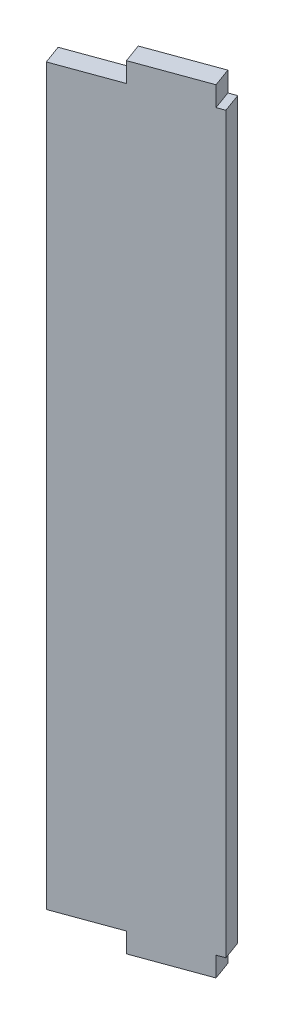
ISO-10303-21;
HEADER;
FILE_DESCRIPTION(('STEP AP214'),'2;1');
FILE_NAME('part.step','',(''),(''),'','','');
FILE_SCHEMA(('AUTOMOTIVE_DESIGN { 1 0 10303 214 1 1 1 1 }'));
ENDSEC;
DATA;
#1=APPLICATION_CONTEXT('core data for automotive mechanical design processes');
#2=APPLICATION_PROTOCOL_DEFINITION('international standard','automotive_design',2000,#1);
#3=PRODUCT_CONTEXT('',#1,'mechanical');
#4=PRODUCT('Part','Part','',(#3));
#5=PRODUCT_RELATED_PRODUCT_CATEGORY('part','',(#4));
#6=PRODUCT_DEFINITION_FORMATION('','',#4);
#7=PRODUCT_DEFINITION_CONTEXT('part definition',#1,'design');
#8=PRODUCT_DEFINITION('design','',#6,#7);
#9=PRODUCT_DEFINITION_SHAPE('','',#8);
#10=(LENGTH_UNIT() NAMED_UNIT(*) SI_UNIT(.MILLI.,.METRE.));
#11=(NAMED_UNIT(*) PLANE_ANGLE_UNIT() SI_UNIT($,.RADIAN.));
#12=(NAMED_UNIT(*) SI_UNIT($,.STERADIAN.) SOLID_ANGLE_UNIT());
#13=UNCERTAINTY_MEASURE_WITH_UNIT(LENGTH_MEASURE(1.E-05),#10,'distance_accuracy_value','');
#14=(GEOMETRIC_REPRESENTATION_CONTEXT(3) GLOBAL_UNCERTAINTY_ASSIGNED_CONTEXT((#13)) GLOBAL_UNIT_ASSIGNED_CONTEXT((#10,
#11,#12)) REPRESENTATION_CONTEXT('',''));
#15=CARTESIAN_POINT('',(0.,0.,0.));
#16=DIRECTION('',(0.,0.,1.));
#17=DIRECTION('',(1.,0.,0.));
#18=AXIS2_PLACEMENT_3D('',#15,#16,#17);
#19=CARTESIAN_POINT('',(81.6522586267483,18.4931544247679,109.399122485471));
#20=DIRECTION('',(0.939692620785908,0.,-0.34202014332567));
#21=DIRECTION('',(-0.34202014332567,0.,-0.939692620785908));
#22=AXIS2_PLACEMENT_3D('',#19,#20,#21);
#23=PLANE('',#22);
#24=DIRECTION('',(0.,-1.,0.));
#25=VECTOR('',#24,1.);
#26=CARTESIAN_POINT('',(80.6843416211367,18.4931544247679,106.739792368647));
#27=LINE('',#26,#25);
#28=CARTESIAN_POINT('',(80.6843416211367,18.4931544247679,106.739792368647));
#29=VERTEX_POINT('',#28);
#30=CARTESIAN_POINT('',(80.6843416211367,15.6631544247679,106.739792368647));
#31=VERTEX_POINT('',#30);
#32=EDGE_CURVE('E153',#29,#31,#27,.T.);
#33=ORIENTED_EDGE('',*,*,#32,.T.);
#34=DIRECTION('',(-0.34202014332567,0.,-0.939692620785908));
#35=VECTOR('',#34,1.);
#36=CARTESIAN_POINT('',(81.6522586267483,15.6631544247679,109.399122485471));
#37=LINE('',#36,#35);
#38=CARTESIAN_POINT('',(81.6522586267483,15.6631544247679,109.399122485471));
#39=VERTEX_POINT('',#38);
#40=EDGE_CURVE('E11',#39,#31,#37,.T.);
#41=ORIENTED_EDGE('',*,*,#40,.F.);
#42=DIRECTION('',(0.,-1.,0.));
#43=VECTOR('',#42,1.);
#44=CARTESIAN_POINT('',(81.6522586267483,18.4931544247679,109.399122485471));
#45=LINE('',#44,#43);
#46=CARTESIAN_POINT('',(81.6522586267483,18.4931544247679,109.399122485471));
#47=VERTEX_POINT('',#46);
#48=EDGE_CURVE('E175',#47,#39,#45,.T.);
#49=ORIENTED_EDGE('',*,*,#48,.F.);
#50=DIRECTION('',(-0.34202014332567,0.,-0.939692620785908));
#51=VECTOR('',#50,1.);
#52=CARTESIAN_POINT('',(81.6522586267483,18.4931544247679,109.399122485471));
#53=LINE('',#52,#51);
#54=EDGE_CURVE('E149',#47,#29,#53,.T.);
#55=ORIENTED_EDGE('',*,*,#54,.T.);
#56=EDGE_LOOP('',(#33,#41,#49,#55));
#57=FACE_BOUND('',#56,.T.);
#58=ADVANCED_FACE('F33',(#57),#23,.F.);
#59=CARTESIAN_POINT('',(81.6522586267483,15.6631544247679,109.399122485471));
#60=DIRECTION('',(0.,1.,0.));
#61=DIRECTION('',(-1.,0.,0.));
#62=AXIS2_PLACEMENT_3D('',#59,#60,#61);
#63=PLANE('',#62);
#64=DIRECTION('',(0.939692620785908,0.,-0.34202014332567));
#65=VECTOR('',#64,1.);
#66=CARTESIAN_POINT('',(80.6843416211367,15.6631544247679,106.739792368647));
#67=LINE('',#66,#65);
#68=CARTESIAN_POINT('',(90.0812678289958,15.6631544247679,103.31959093539));
#69=VERTEX_POINT('',#68);
#70=EDGE_CURVE('E156',#31,#69,#67,.T.);
#71=ORIENTED_EDGE('',*,*,#70,.T.);
#72=DIRECTION('',(-0.34202014332567,0.,-0.939692620785908));
#73=VECTOR('',#72,1.);
#74=CARTESIAN_POINT('',(91.0491848346074,15.6631544247679,105.978921052214));
#75=LINE('',#74,#73);
#76=CARTESIAN_POINT('',(91.0491848346074,15.6631544247679,105.978921052214));
#77=VERTEX_POINT('',#76);
#78=EDGE_CURVE('E41',#77,#69,#75,.T.);
#79=ORIENTED_EDGE('',*,*,#78,.F.);
#80=DIRECTION('',(0.939692620785908,0.,-0.34202014332567));
#81=VECTOR('',#80,1.);
#82=CARTESIAN_POINT('',(81.6522586267483,15.6631544247679,109.399122485471));
#83=LINE('',#82,#81);
#84=EDGE_CURVE('E104',#39,#77,#83,.T.);
#85=ORIENTED_EDGE('',*,*,#84,.F.);
#86=ORIENTED_EDGE('',*,*,#40,.T.);
#87=EDGE_LOOP('',(#71,#79,#85,#86));
#88=FACE_BOUND('',#87,.T.);
#89=ADVANCED_FACE('F253',(#88),#63,.F.);
#90=CARTESIAN_POINT('',(91.0491848346074,15.6631544247679,105.978921052214));
#91=DIRECTION('',(-0.939692620785908,0.,0.34202014332567));
#92=DIRECTION('',(0.34202014332567,0.,0.939692620785908));
#93=AXIS2_PLACEMENT_3D('',#90,#91,#92);
#94=PLANE('',#93);
#95=DIRECTION('',(0.,1.,0.));
#96=VECTOR('',#95,1.);
#97=CARTESIAN_POINT('',(90.0812678289958,15.6631544247679,103.31959093539));
#98=LINE('',#97,#96);
#99=CARTESIAN_POINT('',(90.0812678289957,18.4931544247679,103.31959093539));
#100=VERTEX_POINT('',#99);
#101=EDGE_CURVE('E158',#69,#100,#98,.T.);
#102=ORIENTED_EDGE('',*,*,#101,.T.);
#103=DIRECTION('',(-0.34202014332567,0.,-0.939692620785908));
#104=VECTOR('',#103,1.);
#105=CARTESIAN_POINT('',(91.0491848346074,18.4931544247679,105.978921052214));
#106=LINE('',#105,#104);
#107=CARTESIAN_POINT('',(91.0491848346074,18.4931544247679,105.978921052214));
#108=VERTEX_POINT('',#107);
#109=EDGE_CURVE('E194',#108,#100,#106,.T.);
#110=ORIENTED_EDGE('',*,*,#109,.F.);
#111=DIRECTION('',(0.,1.,0.));
#112=VECTOR('',#111,1.);
#113=CARTESIAN_POINT('',(91.0491848346074,15.6631544247679,105.978921052214));
#114=LINE('',#113,#112);
#115=EDGE_CURVE('E202',#77,#108,#114,.T.);
#116=ORIENTED_EDGE('',*,*,#115,.F.);
#117=ORIENTED_EDGE('',*,*,#78,.T.);
#118=EDGE_LOOP('',(#102,#110,#116,#117));
#119=FACE_BOUND('',#118,.T.);
#120=ADVANCED_FACE('F200',(#119),#94,.F.);
#121=CARTESIAN_POINT('',(92.0823208338306,18.4931544247679,105.602890300548));
#122=DIRECTION('',(0.,1.,0.));
#123=DIRECTION('',(-1.,0.,0.));
#124=AXIS2_PLACEMENT_3D('',#121,#122,#123);
#125=PLANE('',#124);
#126=DIRECTION('',(0.939692620785908,0.,-0.342020143325669));
#127=VECTOR('',#126,1.);
#128=CARTESIAN_POINT('',(91.1144038282189,18.4931544247679,102.943560183724));
#129=LINE('',#128,#127);
#130=CARTESIAN_POINT('',(91.1144038282189,18.4931544247679,102.943560183724));
#131=VERTEX_POINT('',#130);
#132=EDGE_CURVE('E160',#100,#131,#129,.T.);
#133=ORIENTED_EDGE('',*,*,#132,.T.);
#134=DIRECTION('',(-0.34202014332567,0.,-0.939692620785908));
#135=VECTOR('',#134,1.);
#136=CARTESIAN_POINT('',(92.0823208338306,18.4931544247679,105.602890300548));
#137=LINE('',#136,#135);
#138=CARTESIAN_POINT('',(92.0823208338306,18.4931544247679,105.602890300548));
#139=VERTEX_POINT('',#138);
#140=EDGE_CURVE('E191',#139,#131,#137,.T.);
#141=ORIENTED_EDGE('',*,*,#140,.F.);
#142=DIRECTION('',(0.939692620785908,0.,-0.342020143325669));
#143=VECTOR('',#142,1.);
#144=CARTESIAN_POINT('',(92.0823208338306,18.4931544247679,105.602890300548));
#145=LINE('',#144,#143);
#146=EDGE_CURVE('E220',#108,#139,#145,.T.);
#147=ORIENTED_EDGE('',*,*,#146,.F.);
#148=ORIENTED_EDGE('',*,*,#109,.T.);
#149=EDGE_LOOP('',(#133,#141,#147,#148));
#150=FACE_BOUND('',#149,.T.);
#151=ADVANCED_FACE('F211',(#150),#125,.F.);
#152=CARTESIAN_POINT('',(92.0823208338306,123.493154424767,105.602890300548));
#153=DIRECTION('',(-0.939692620785908,0.,0.34202014332567));
#154=DIRECTION('',(0.34202014332567,0.,0.939692620785908));
#155=AXIS2_PLACEMENT_3D('',#152,#153,#154);
#156=PLANE('',#155);
#157=DIRECTION('',(0.,1.,0.));
#158=VECTOR('',#157,1.);
#159=CARTESIAN_POINT('',(91.1144038282189,123.493154424767,102.943560183724));
#160=LINE('',#159,#158);
#161=CARTESIAN_POINT('',(91.1144038282189,123.493154424767,102.943560183724));
#162=VERTEX_POINT('',#161);
#163=EDGE_CURVE('E162',#131,#162,#160,.T.);
#164=ORIENTED_EDGE('',*,*,#163,.T.);
#165=DIRECTION('',(-0.34202014332567,0.,-0.939692620785908));
#166=VECTOR('',#165,1.);
#167=CARTESIAN_POINT('',(92.0823208338306,123.493154424767,105.602890300548));
#168=LINE('',#167,#166);
#169=CARTESIAN_POINT('',(92.0823208338306,123.493154424767,105.602890300548));
#170=VERTEX_POINT('',#169);
#171=EDGE_CURVE('E188',#170,#162,#168,.T.);
#172=ORIENTED_EDGE('',*,*,#171,.F.);
#173=DIRECTION('',(0.,1.,0.));
#174=VECTOR('',#173,1.);
#175=CARTESIAN_POINT('',(92.0823208338306,123.493154424767,105.602890300548));
#176=LINE('',#175,#174);
#177=EDGE_CURVE('E217',#139,#170,#176,.T.);
#178=ORIENTED_EDGE('',*,*,#177,.F.);
#179=ORIENTED_EDGE('',*,*,#140,.T.);
#180=EDGE_LOOP('',(#164,#172,#178,#179));
#181=FACE_BOUND('',#180,.T.);
#182=ADVANCED_FACE('F215',(#181),#156,.F.);
#183=CARTESIAN_POINT('',(91.0491848346074,123.493154424767,105.978921052214));
#184=DIRECTION('',(0.,-1.,0.));
#185=DIRECTION('',(1.,0.,0.));
#186=AXIS2_PLACEMENT_3D('',#183,#184,#185);
#187=PLANE('',#186);
#188=DIRECTION('',(-0.939692620785908,0.,0.342020143325669));
#189=VECTOR('',#188,1.);
#190=CARTESIAN_POINT('',(90.0812678289957,123.493154424767,103.31959093539));
#191=LINE('',#190,#189);
#192=CARTESIAN_POINT('',(90.0812678289957,123.493154424767,103.31959093539));
#193=VERTEX_POINT('',#192);
#194=EDGE_CURVE('E164',#162,#193,#191,.T.);
#195=ORIENTED_EDGE('',*,*,#194,.T.);
#196=DIRECTION('',(-0.34202014332567,0.,-0.939692620785908));
#197=VECTOR('',#196,1.);
#198=CARTESIAN_POINT('',(91.0491848346074,123.493154424767,105.978921052214));
#199=LINE('',#198,#197);
#200=CARTESIAN_POINT('',(91.0491848346074,123.493154424767,105.978921052214));
#201=VERTEX_POINT('',#200);
#202=EDGE_CURVE('E185',#201,#193,#199,.T.);
#203=ORIENTED_EDGE('',*,*,#202,.F.);
#204=DIRECTION('',(-0.939692620785908,0.,0.342020143325669));
#205=VECTOR('',#204,1.);
#206=CARTESIAN_POINT('',(91.0491848346074,123.493154424767,105.978921052214));
#207=LINE('',#206,#205);
#208=EDGE_CURVE('E219',#170,#201,#207,.T.);
#209=ORIENTED_EDGE('',*,*,#208,.F.);
#210=ORIENTED_EDGE('',*,*,#171,.T.);
#211=EDGE_LOOP('',(#195,#203,#209,#210));
#212=FACE_BOUND('',#211,.T.);
#213=ADVANCED_FACE('F266',(#212),#187,.F.);
#214=CARTESIAN_POINT('',(91.0491848346074,123.493154424767,105.978921052214));
#215=DIRECTION('',(-0.939692620785908,0.,0.34202014332567));
#216=DIRECTION('',(0.34202014332567,0.,0.939692620785908));
#217=AXIS2_PLACEMENT_3D('',#214,#215,#216);
#218=PLANE('',#217);
#219=DIRECTION('',(0.,1.,0.));
#220=VECTOR('',#219,1.);
#221=CARTESIAN_POINT('',(90.0812678289957,123.493154424767,103.31959093539));
#222=LINE('',#221,#220);
#223=CARTESIAN_POINT('',(90.0812678289957,126.323154424767,103.31959093539));
#224=VERTEX_POINT('',#223);
#225=EDGE_CURVE('E166',#193,#224,#222,.T.);
#226=ORIENTED_EDGE('',*,*,#225,.T.);
#227=DIRECTION('',(-0.34202014332567,0.,-0.939692620785908));
#228=VECTOR('',#227,1.);
#229=CARTESIAN_POINT('',(91.0491848346074,126.323154424767,105.978921052214));
#230=LINE('',#229,#228);
#231=CARTESIAN_POINT('',(91.0491848346074,126.323154424767,105.978921052214));
#232=VERTEX_POINT('',#231);
#233=EDGE_CURVE('E182',#232,#224,#230,.T.);
#234=ORIENTED_EDGE('',*,*,#233,.F.);
#235=DIRECTION('',(0.,1.,0.));
#236=VECTOR('',#235,1.);
#237=CARTESIAN_POINT('',(91.0491848346074,123.493154424767,105.978921052214));
#238=LINE('',#237,#236);
#239=EDGE_CURVE('E222',#201,#232,#238,.T.);
#240=ORIENTED_EDGE('',*,*,#239,.F.);
#241=ORIENTED_EDGE('',*,*,#202,.T.);
#242=EDGE_LOOP('',(#226,#234,#240,#241));
#243=FACE_BOUND('',#242,.T.);
#244=ADVANCED_FACE('F269',(#243),#218,.F.);
#245=CARTESIAN_POINT('',(91.0491848346074,126.323154424767,105.978921052214));
#246=DIRECTION('',(0.,-1.,0.));
#247=DIRECTION('',(0.,0.,-1.));
#248=AXIS2_PLACEMENT_3D('',#245,#246,#247);
#249=PLANE('',#248);
#250=DIRECTION('',(-0.939692620785908,0.,0.342020143325669));
#251=VECTOR('',#250,1.);
#252=CARTESIAN_POINT('',(90.0812678289957,126.323154424767,103.31959093539));
#253=LINE('',#252,#251);
#254=CARTESIAN_POINT('',(80.6843416211366,126.323154424767,106.739792368647));
#255=VERTEX_POINT('',#254);
#256=EDGE_CURVE('E168',#224,#255,#253,.T.);
#257=ORIENTED_EDGE('',*,*,#256,.T.);
#258=DIRECTION('',(-0.34202014332567,0.,-0.939692620785908));
#259=VECTOR('',#258,1.);
#260=CARTESIAN_POINT('',(81.6522586267483,126.323154424767,109.399122485471));
#261=LINE('',#260,#259);
#262=CARTESIAN_POINT('',(81.6522586267483,126.323154424767,109.399122485471));
#263=VERTEX_POINT('',#262);
#264=EDGE_CURVE('E179',#263,#255,#261,.T.);
#265=ORIENTED_EDGE('',*,*,#264,.F.);
#266=DIRECTION('',(-0.939692620785908,0.,0.342020143325669));
#267=VECTOR('',#266,1.);
#268=CARTESIAN_POINT('',(91.0491848346074,126.323154424767,105.978921052214));
#269=LINE('',#268,#267);
#270=EDGE_CURVE('E228',#232,#263,#269,.T.);
#271=ORIENTED_EDGE('',*,*,#270,.F.);
#272=ORIENTED_EDGE('',*,*,#233,.T.);
#273=EDGE_LOOP('',(#257,#265,#271,#272));
#274=FACE_BOUND('',#273,.T.);
#275=ADVANCED_FACE('F234',(#274),#249,.F.);
#276=CARTESIAN_POINT('',(81.6522586267483,126.323154424767,109.399122485471));
#277=DIRECTION('',(0.939692620785908,0.,-0.34202014332567));
#278=DIRECTION('',(-0.34202014332567,0.,-0.939692620785908));
#279=AXIS2_PLACEMENT_3D('',#276,#277,#278);
#280=PLANE('',#279);
#281=DIRECTION('',(0.,-1.,0.));
#282=VECTOR('',#281,1.);
#283=CARTESIAN_POINT('',(80.6843416211366,126.323154424767,106.739792368647));
#284=LINE('',#283,#282);
#285=CARTESIAN_POINT('',(80.6843416211366,123.493154424767,106.739792368647));
#286=VERTEX_POINT('',#285);
#287=EDGE_CURVE('E170',#255,#286,#284,.T.);
#288=ORIENTED_EDGE('',*,*,#287,.T.);
#289=DIRECTION('',(-0.34202014332567,0.,-0.939692620785908));
#290=VECTOR('',#289,1.);
#291=CARTESIAN_POINT('',(81.6522586267483,123.493154424767,109.399122485471));
#292=LINE('',#291,#290);
#293=CARTESIAN_POINT('',(81.6522586267483,123.493154424767,109.399122485471));
#294=VERTEX_POINT('',#293);
#295=EDGE_CURVE('E144',#294,#286,#292,.T.);
#296=ORIENTED_EDGE('',*,*,#295,.F.);
#297=DIRECTION('',(0.,-1.,0.));
#298=VECTOR('',#297,1.);
#299=CARTESIAN_POINT('',(81.6522586267483,126.323154424767,109.399122485471));
#300=LINE('',#299,#298);
#301=EDGE_CURVE('E135',#263,#294,#300,.T.);
#302=ORIENTED_EDGE('',*,*,#301,.F.);
#303=ORIENTED_EDGE('',*,*,#264,.T.);
#304=EDGE_LOOP('',(#288,#296,#302,#303));
#305=FACE_BOUND('',#304,.T.);
#306=ADVANCED_FACE('F238',(#305),#280,.F.);
#307=CARTESIAN_POINT('',(73.2489145621063,123.493154424767,112.457689593298));
#308=DIRECTION('',(0.,-1.,0.));
#309=DIRECTION('',(0.,0.,-1.));
#310=AXIS2_PLACEMENT_3D('',#307,#308,#309);
#311=PLANE('',#310);
#312=DIRECTION('',(-0.939692620785908,0.,0.34202014332567));
#313=VECTOR('',#312,1.);
#314=CARTESIAN_POINT('',(72.2809975564946,123.493154424767,109.798359476474));
#315=LINE('',#314,#313);
#316=CARTESIAN_POINT('',(72.2809975564946,123.493154424767,109.798359476474));
#317=VERTEX_POINT('',#316);
#318=EDGE_CURVE('E143',#286,#317,#315,.T.);
#319=ORIENTED_EDGE('',*,*,#318,.T.);
#320=DIRECTION('',(-0.34202014332567,0.,-0.939692620785908));
#321=VECTOR('',#320,1.);
#322=CARTESIAN_POINT('',(73.2489145621063,123.493154424767,112.457689593298));
#323=LINE('',#322,#321);
#324=CARTESIAN_POINT('',(73.2489145621063,123.493154424767,112.457689593298));
#325=VERTEX_POINT('',#324);
#326=EDGE_CURVE('E140',#325,#317,#323,.T.);
#327=ORIENTED_EDGE('',*,*,#326,.F.);
#328=DIRECTION('',(-0.939692620785908,0.,0.34202014332567));
#329=VECTOR('',#328,1.);
#330=CARTESIAN_POINT('',(73.2489145621063,123.493154424767,112.457689593298));
#331=LINE('',#330,#329);
#332=EDGE_CURVE('E129',#294,#325,#331,.T.);
#333=ORIENTED_EDGE('',*,*,#332,.F.);
#334=ORIENTED_EDGE('',*,*,#295,.T.);
#335=EDGE_LOOP('',(#319,#327,#333,#334));
#336=FACE_BOUND('',#335,.T.);
#337=ADVANCED_FACE('F141',(#336),#311,.F.);
#338=CARTESIAN_POINT('',(73.2489145621063,18.4931544247679,112.457689593298));
#339=DIRECTION('',(0.939692620785908,0.,-0.34202014332567));
#340=DIRECTION('',(-0.34202014332567,0.,-0.939692620785908));
#341=AXIS2_PLACEMENT_3D('',#338,#339,#340);
#342=PLANE('',#341);
#343=DIRECTION('',(0.,-1.,0.));
#344=VECTOR('',#343,1.);
#345=CARTESIAN_POINT('',(72.2809975564946,18.4931544247679,109.798359476474));
#346=LINE('',#345,#344);
#347=CARTESIAN_POINT('',(72.2809975564946,18.4931544247679,109.798359476474));
#348=VERTEX_POINT('',#347);
#349=EDGE_CURVE('E90',#317,#348,#346,.T.);
#350=ORIENTED_EDGE('',*,*,#349,.T.);
#351=DIRECTION('',(-0.34202014332567,0.,-0.939692620785908));
#352=VECTOR('',#351,1.);
#353=CARTESIAN_POINT('',(73.2489145621063,18.4931544247679,112.457689593298));
#354=LINE('',#353,#352);
#355=CARTESIAN_POINT('',(73.2489145621063,18.4931544247679,112.457689593298));
#356=VERTEX_POINT('',#355);
#357=EDGE_CURVE('E145',#356,#348,#354,.T.);
#358=ORIENTED_EDGE('',*,*,#357,.F.);
#359=DIRECTION('',(0.,-1.,0.));
#360=VECTOR('',#359,1.);
#361=CARTESIAN_POINT('',(73.2489145621063,18.4931544247679,112.457689593298));
#362=LINE('',#361,#360);
#363=EDGE_CURVE('E133',#325,#356,#362,.T.);
#364=ORIENTED_EDGE('',*,*,#363,.F.);
#365=ORIENTED_EDGE('',*,*,#326,.T.);
#366=EDGE_LOOP('',(#350,#358,#364,#365));
#367=FACE_BOUND('',#366,.T.);
#368=ADVANCED_FACE('F147',(#367),#342,.F.);
#369=CARTESIAN_POINT('',(81.6522586267483,18.4931544247679,109.399122485471));
#370=DIRECTION('',(0.,1.,0.));
#371=DIRECTION('',(0.,0.,1.));
#372=AXIS2_PLACEMENT_3D('',#369,#370,#371);
#373=PLANE('',#372);
#374=DIRECTION('',(0.939692620785908,0.,-0.342020143325669));
#375=VECTOR('',#374,1.);
#376=CARTESIAN_POINT('',(80.6843416211367,18.4931544247679,106.739792368647));
#377=LINE('',#376,#375);
#378=EDGE_CURVE('E96',#348,#29,#377,.T.);
#379=ORIENTED_EDGE('',*,*,#378,.T.);
#380=ORIENTED_EDGE('',*,*,#54,.F.);
#381=DIRECTION('',(0.939692620785908,0.,-0.342020143325669));
#382=VECTOR('',#381,1.);
#383=CARTESIAN_POINT('',(81.6522586267483,18.4931544247679,109.399122485471));
#384=LINE('',#383,#382);
#385=EDGE_CURVE('E49',#356,#47,#384,.T.);
#386=ORIENTED_EDGE('',*,*,#385,.F.);
#387=ORIENTED_EDGE('',*,*,#357,.T.);
#388=EDGE_LOOP('',(#379,#380,#386,#387));
#389=FACE_BOUND('',#388,.T.);
#390=ADVANCED_FACE('F242',(#389),#373,.F.);
#391=CARTESIAN_POINT('',(44.7117000409277,0.,122.844386247877));
#392=DIRECTION('',(0.34202014332567,0.,0.939692620785908));
#393=DIRECTION('',(0.939692620785908,0.,-0.34202014332567));
#394=AXIS2_PLACEMENT_3D('',#391,#392,#393);
#395=PLANE('',#394);
#396=ORIENTED_EDGE('',*,*,#48,.T.);
#397=ORIENTED_EDGE('',*,*,#84,.T.);
#398=ORIENTED_EDGE('',*,*,#115,.T.);
#399=ORIENTED_EDGE('',*,*,#146,.T.);
#400=ORIENTED_EDGE('',*,*,#177,.T.);
#401=ORIENTED_EDGE('',*,*,#208,.T.);
#402=ORIENTED_EDGE('',*,*,#239,.T.);
#403=ORIENTED_EDGE('',*,*,#270,.T.);
#404=ORIENTED_EDGE('',*,*,#301,.T.);
#405=ORIENTED_EDGE('',*,*,#332,.T.);
#406=ORIENTED_EDGE('',*,*,#363,.T.);
#407=ORIENTED_EDGE('',*,*,#385,.T.);
#408=EDGE_LOOP('',(#396,#397,#398,#399,#400,#401,#402,#403,#404,#405,#406,#407));
#409=FACE_BOUND('',#408,.T.);
#410=ADVANCED_FACE('F131',(#409),#395,.T.);
#411=CARTESIAN_POINT('',(43.7437830353161,0.,120.185056131052));
#412=DIRECTION('',(0.34202014332567,0.,0.939692620785908));
#413=DIRECTION('',(0.939692620785908,0.,-0.34202014332567));
#414=AXIS2_PLACEMENT_3D('',#411,#412,#413);
#415=PLANE('',#414);
#416=ORIENTED_EDGE('',*,*,#32,.F.);
#417=ORIENTED_EDGE('',*,*,#378,.F.);
#418=ORIENTED_EDGE('',*,*,#349,.F.);
#419=ORIENTED_EDGE('',*,*,#318,.F.);
#420=ORIENTED_EDGE('',*,*,#287,.F.);
#421=ORIENTED_EDGE('',*,*,#256,.F.);
#422=ORIENTED_EDGE('',*,*,#225,.F.);
#423=ORIENTED_EDGE('',*,*,#194,.F.);
#424=ORIENTED_EDGE('',*,*,#163,.F.);
#425=ORIENTED_EDGE('',*,*,#132,.F.);
#426=ORIENTED_EDGE('',*,*,#101,.F.);
#427=ORIENTED_EDGE('',*,*,#70,.F.);
#428=EDGE_LOOP('',(#416,#417,#418,#419,#420,#421,#422,#423,#424,#425,#426,#427));
#429=FACE_BOUND('',#428,.T.);
#430=ADVANCED_FACE('F206',(#429),#415,.F.);
#431=CLOSED_SHELL('',(#58,#89,#120,#151,#182,#213,#244,#275,#306,#337,#368,#390,#410,#430));
#432=MANIFOLD_SOLID_BREP('B2',#431);
#433=ADVANCED_BREP_SHAPE_REPRESENTATION('',(#18,#432),#14);
#434=SHAPE_DEFINITION_REPRESENTATION(#9,#433);
ENDSEC;
END-ISO-10303-21;
